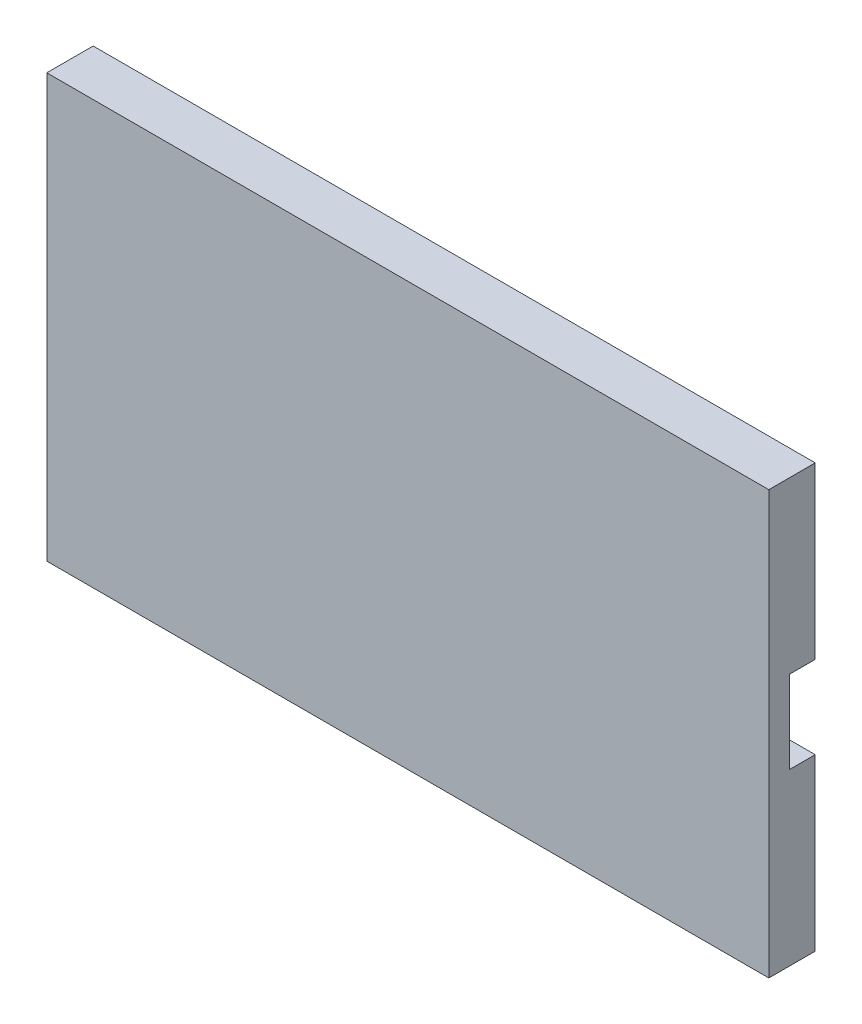
ISO-10303-21;
HEADER;
FILE_DESCRIPTION(('STEP AP214'),'2;1');
FILE_NAME('part.step','',(''),(''),'','','');
FILE_SCHEMA(('AUTOMOTIVE_DESIGN { 1 0 10303 214 1 1 1 1 }'));
ENDSEC;
DATA;
#1=APPLICATION_CONTEXT('core data for automotive mechanical design processes');
#2=APPLICATION_PROTOCOL_DEFINITION('international standard','automotive_design',2000,#1);
#3=PRODUCT_CONTEXT('',#1,'mechanical');
#4=PRODUCT('Part','Part','',(#3));
#5=PRODUCT_RELATED_PRODUCT_CATEGORY('part','',(#4));
#6=PRODUCT_DEFINITION_FORMATION('','',#4);
#7=PRODUCT_DEFINITION_CONTEXT('part definition',#1,'design');
#8=PRODUCT_DEFINITION('design','',#6,#7);
#9=PRODUCT_DEFINITION_SHAPE('','',#8);
#10=(LENGTH_UNIT() NAMED_UNIT(*) SI_UNIT(.MILLI.,.METRE.));
#11=(NAMED_UNIT(*) PLANE_ANGLE_UNIT() SI_UNIT($,.RADIAN.));
#12=(NAMED_UNIT(*) SI_UNIT($,.STERADIAN.) SOLID_ANGLE_UNIT());
#13=UNCERTAINTY_MEASURE_WITH_UNIT(LENGTH_MEASURE(1.E-05),#10,'distance_accuracy_value','');
#14=(GEOMETRIC_REPRESENTATION_CONTEXT(3) GLOBAL_UNCERTAINTY_ASSIGNED_CONTEXT((#13)) GLOBAL_UNIT_ASSIGNED_CONTEXT((#10,
#11,#12)) REPRESENTATION_CONTEXT('',''));
#15=CARTESIAN_POINT('',(0.,0.,0.));
#16=DIRECTION('',(0.,0.,1.));
#17=DIRECTION('',(1.,0.,0.));
#18=AXIS2_PLACEMENT_3D('',#15,#16,#17);
#19=CARTESIAN_POINT('',(4.70000076,0.3999992,0.2499995));
#20=DIRECTION('',(0.,0.,1.));
#21=DIRECTION('',(1.,0.,0.));
#22=AXIS2_PLACEMENT_3D('',#19,#20,#21);
#23=PLANE('',#22);
#24=DIRECTION('',(0.,1.,0.));
#25=VECTOR('',#24,1.);
#26=CARTESIAN_POINT('',(7.00000124,0.3999992,0.2499995));
#27=LINE('',#26,#25);
#28=CARTESIAN_POINT('',(7.00000124,-0.3999992,0.2499995));
#29=VERTEX_POINT('',#28);
#30=CARTESIAN_POINT('',(7.00000124,0.3999992,0.2499995));
#31=VERTEX_POINT('',#30);
#32=EDGE_CURVE('E20',#29,#31,#27,.T.);
#33=ORIENTED_EDGE('',*,*,#32,.F.);
#34=DIRECTION('',(1.,0.,0.));
#35=VECTOR('',#34,1.);
#36=CARTESIAN_POINT('',(7.40000044,-0.3999992,0.2499995));
#37=LINE('',#36,#35);
#38=CARTESIAN_POINT('',(4.70000076,-0.3999992,0.2499995));
#39=VERTEX_POINT('',#38);
#40=EDGE_CURVE('E133',#29,#39,#37,.F.);
#41=ORIENTED_EDGE('',*,*,#40,.T.);
#42=DIRECTION('',(0.,1.,0.));
#43=VECTOR('',#42,1.);
#44=CARTESIAN_POINT('',(4.70000076,-0.3999992,0.2499995));
#45=LINE('',#44,#43);
#46=CARTESIAN_POINT('',(4.70000076,0.3999992,0.2499995));
#47=VERTEX_POINT('',#46);
#48=EDGE_CURVE('E124',#39,#47,#45,.T.);
#49=ORIENTED_EDGE('',*,*,#48,.T.);
#50=DIRECTION('',(1.,0.,0.));
#51=VECTOR('',#50,1.);
#52=CARTESIAN_POINT('',(4.70000076,0.3999992,0.2499995));
#53=LINE('',#52,#51);
#54=EDGE_CURVE('E103',#47,#31,#53,.T.);
#55=ORIENTED_EDGE('',*,*,#54,.T.);
#56=EDGE_LOOP('',(#33,#41,#49,#55));
#57=FACE_BOUND('',#56,.T.);
#58=ADVANCED_FACE('F17',(#57),#23,.F.);
#59=CARTESIAN_POINT('',(-0.3999992,0.3999992,0.2499995));
#60=DIRECTION('',(0.,0.,1.));
#61=DIRECTION('',(1.,0.,0.));
#62=AXIS2_PLACEMENT_3D('',#59,#60,#61);
#63=PLANE('',#62);
#64=DIRECTION('',(0.,1.,0.));
#65=VECTOR('',#64,1.);
#66=CARTESIAN_POINT('',(0.,0.3999992,0.2499995));
#67=LINE('',#66,#65);
#68=CARTESIAN_POINT('',(0.,0.3999992,0.2499995));
#69=VERTEX_POINT('',#68);
#70=CARTESIAN_POINT('',(0.,-0.3999992,0.2499995));
#71=VERTEX_POINT('',#70);
#72=EDGE_CURVE('E117',#69,#71,#67,.F.);
#73=ORIENTED_EDGE('',*,*,#72,.F.);
#74=DIRECTION('',(1.,0.,0.));
#75=VECTOR('',#74,1.);
#76=CARTESIAN_POINT('',(-0.3999992,0.3999992,0.2499995));
#77=LINE('',#76,#75);
#78=CARTESIAN_POINT('',(2.30000048,0.3999992,0.2499995));
#79=VERTEX_POINT('',#78);
#80=EDGE_CURVE('E152',#69,#79,#77,.T.);
#81=ORIENTED_EDGE('',*,*,#80,.T.);
#82=DIRECTION('',(0.,1.,0.));
#83=VECTOR('',#82,1.);
#84=CARTESIAN_POINT('',(2.30000048,0.3999992,0.2499995));
#85=LINE('',#84,#83);
#86=CARTESIAN_POINT('',(2.30000048,-0.3999992,0.2499995));
#87=VERTEX_POINT('',#86);
#88=EDGE_CURVE('E143',#79,#87,#85,.F.);
#89=ORIENTED_EDGE('',*,*,#88,.T.);
#90=DIRECTION('',(1.,0.,0.));
#91=VECTOR('',#90,1.);
#92=CARTESIAN_POINT('',(2.30000048,-0.3999992,0.2499995));
#93=LINE('',#92,#91);
#94=EDGE_CURVE('E135',#87,#71,#93,.F.);
#95=ORIENTED_EDGE('',*,*,#94,.T.);
#96=EDGE_LOOP('',(#73,#81,#89,#95));
#97=FACE_BOUND('',#96,.T.);
#98=ADVANCED_FACE('F251',(#97),#63,.F.);
#99=CARTESIAN_POINT('',(4.70000076,0.3999992,-1.00000054));
#100=DIRECTION('',(0.,1.,0.));
#101=DIRECTION('',(0.,0.,1.));
#102=AXIS2_PLACEMENT_3D('',#99,#100,#101);
#103=PLANE('',#102);
#104=DIRECTION('',(0.,0.,1.));
#105=VECTOR('',#104,1.);
#106=CARTESIAN_POINT('',(7.00000124,0.3999992,-1.00000054));
#107=LINE('',#106,#105);
#108=CARTESIAN_POINT('',(7.00000124,0.3999992,0.));
#109=VERTEX_POINT('',#108);
#110=EDGE_CURVE('E110',#31,#109,#107,.F.);
#111=ORIENTED_EDGE('',*,*,#110,.F.);
#112=ORIENTED_EDGE('',*,*,#54,.F.);
#113=DIRECTION('',(0.,0.,1.));
#114=VECTOR('',#113,1.);
#115=CARTESIAN_POINT('',(4.70000076,0.3999992,-1.00000054));
#116=LINE('',#115,#114);
#117=CARTESIAN_POINT('',(4.70000076,0.3999992,0.));
#118=VERTEX_POINT('',#117);
#119=EDGE_CURVE('E121',#47,#118,#116,.F.);
#120=ORIENTED_EDGE('',*,*,#119,.T.);
#121=DIRECTION('',(-1.,0.,0.));
#122=VECTOR('',#121,1.);
#123=CARTESIAN_POINT('',(0.,0.3999992,0.));
#124=LINE('',#123,#122);
#125=EDGE_CURVE('E119',#109,#118,#124,.T.);
#126=ORIENTED_EDGE('',*,*,#125,.F.);
#127=EDGE_LOOP('',(#111,#112,#120,#126));
#128=FACE_BOUND('',#127,.T.);
#129=ADVANCED_FACE('F118',(#128),#103,.F.);
#130=CARTESIAN_POINT('',(4.70000076,-0.3999992,-1.00000054));
#131=DIRECTION('',(-1.,0.,0.));
#132=DIRECTION('',(0.,0.,1.));
#133=AXIS2_PLACEMENT_3D('',#130,#131,#132);
#134=PLANE('',#133);
#135=DIRECTION('',(0.,0.,-1.));
#136=VECTOR('',#135,1.);
#137=CARTESIAN_POINT('',(4.70000076,-0.3999992,-1.00000054));
#138=LINE('',#137,#136);
#139=CARTESIAN_POINT('',(4.70000076,-0.3999992,0.));
#140=VERTEX_POINT('',#139);
#141=EDGE_CURVE('E129',#39,#140,#138,.T.);
#142=ORIENTED_EDGE('',*,*,#141,.T.);
#143=DIRECTION('',(0.,1.,0.));
#144=VECTOR('',#143,1.);
#145=CARTESIAN_POINT('',(4.70000076,2.04999844,0.));
#146=LINE('',#145,#144);
#147=EDGE_CURVE('E156',#118,#140,#146,.F.);
#148=ORIENTED_EDGE('',*,*,#147,.F.);
#149=ORIENTED_EDGE('',*,*,#119,.F.);
#150=ORIENTED_EDGE('',*,*,#48,.F.);
#151=EDGE_LOOP('',(#142,#148,#149,#150));
#152=FACE_BOUND('',#151,.T.);
#153=ADVANCED_FACE('F245',(#152),#134,.F.);
#154=CARTESIAN_POINT('',(7.40000044,-0.3999992,-1.00000054));
#155=DIRECTION('',(0.,-1.,0.));
#156=DIRECTION('',(0.,0.,-1.));
#157=AXIS2_PLACEMENT_3D('',#154,#155,#156);
#158=PLANE('',#157);
#159=DIRECTION('',(0.,0.,-1.));
#160=VECTOR('',#159,1.);
#161=CARTESIAN_POINT('',(7.00000124,-0.3999992,-1.00000054));
#162=LINE('',#161,#160);
#163=CARTESIAN_POINT('',(7.00000124,-0.3999992,0.));
#164=VERTEX_POINT('',#163);
#165=EDGE_CURVE('E113',#164,#29,#162,.F.);
#166=ORIENTED_EDGE('',*,*,#165,.F.);
#167=DIRECTION('',(-1.,0.,0.));
#168=VECTOR('',#167,1.);
#169=CARTESIAN_POINT('',(0.,-0.3999992,0.));
#170=LINE('',#169,#168);
#171=EDGE_CURVE('E158',#140,#164,#170,.F.);
#172=ORIENTED_EDGE('',*,*,#171,.F.);
#173=ORIENTED_EDGE('',*,*,#141,.F.);
#174=ORIENTED_EDGE('',*,*,#40,.F.);
#175=EDGE_LOOP('',(#166,#172,#173,#174));
#176=FACE_BOUND('',#175,.T.);
#177=ADVANCED_FACE('F241',(#176),#158,.F.);
#178=CARTESIAN_POINT('',(2.30000048,-0.3999992,-1.00000054));
#179=DIRECTION('',(0.,-1.,0.));
#180=DIRECTION('',(0.,0.,-1.));
#181=AXIS2_PLACEMENT_3D('',#178,#179,#180);
#182=PLANE('',#181);
#183=DIRECTION('',(0.,0.,-1.));
#184=VECTOR('',#183,1.);
#185=CARTESIAN_POINT('',(0.,-0.3999992,-1.00000054));
#186=LINE('',#185,#184);
#187=CARTESIAN_POINT('',(0.,-0.3999992,0.));
#188=VERTEX_POINT('',#187);
#189=EDGE_CURVE('E138',#71,#188,#186,.T.);
#190=ORIENTED_EDGE('',*,*,#189,.F.);
#191=ORIENTED_EDGE('',*,*,#94,.F.);
#192=DIRECTION('',(0.,0.,-1.));
#193=VECTOR('',#192,1.);
#194=CARTESIAN_POINT('',(2.30000048,-0.3999992,-1.00000054));
#195=LINE('',#194,#193);
#196=CARTESIAN_POINT('',(2.30000048,-0.3999992,0.));
#197=VERTEX_POINT('',#196);
#198=EDGE_CURVE('E140',#87,#197,#195,.T.);
#199=ORIENTED_EDGE('',*,*,#198,.T.);
#200=DIRECTION('',(-1.,0.,0.));
#201=VECTOR('',#200,1.);
#202=CARTESIAN_POINT('',(0.,-0.3999992,0.));
#203=LINE('',#202,#201);
#204=EDGE_CURVE('E161',#188,#197,#203,.F.);
#205=ORIENTED_EDGE('',*,*,#204,.F.);
#206=EDGE_LOOP('',(#190,#191,#199,#205));
#207=FACE_BOUND('',#206,.T.);
#208=ADVANCED_FACE('F237',(#207),#182,.F.);
#209=CARTESIAN_POINT('',(2.30000048,0.3999992,-1.00000054));
#210=DIRECTION('',(1.,0.,0.));
#211=DIRECTION('',(0.,0.,-1.));
#212=AXIS2_PLACEMENT_3D('',#209,#210,#211);
#213=PLANE('',#212);
#214=DIRECTION('',(0.,0.,1.));
#215=VECTOR('',#214,1.);
#216=CARTESIAN_POINT('',(2.30000048,0.3999992,-1.00000054));
#217=LINE('',#216,#215);
#218=CARTESIAN_POINT('',(2.30000048,0.3999992,0.));
#219=VERTEX_POINT('',#218);
#220=EDGE_CURVE('E146',#79,#219,#217,.F.);
#221=ORIENTED_EDGE('',*,*,#220,.T.);
#222=DIRECTION('',(0.,1.,0.));
#223=VECTOR('',#222,1.);
#224=CARTESIAN_POINT('',(2.30000048,2.04999844,0.));
#225=LINE('',#224,#223);
#226=EDGE_CURVE('E163',#197,#219,#225,.T.);
#227=ORIENTED_EDGE('',*,*,#226,.F.);
#228=ORIENTED_EDGE('',*,*,#198,.F.);
#229=ORIENTED_EDGE('',*,*,#88,.F.);
#230=EDGE_LOOP('',(#221,#227,#228,#229));
#231=FACE_BOUND('',#230,.T.);
#232=ADVANCED_FACE('F233',(#231),#213,.F.);
#233=CARTESIAN_POINT('',(-0.3999992,0.3999992,-1.00000054));
#234=DIRECTION('',(0.,1.,0.));
#235=DIRECTION('',(0.,0.,1.));
#236=AXIS2_PLACEMENT_3D('',#233,#234,#235);
#237=PLANE('',#236);
#238=DIRECTION('',(0.,0.,1.));
#239=VECTOR('',#238,1.);
#240=CARTESIAN_POINT('',(0.,0.3999992,-1.00000054));
#241=LINE('',#240,#239);
#242=CARTESIAN_POINT('',(0.,0.3999992,0.));
#243=VERTEX_POINT('',#242);
#244=EDGE_CURVE('E149',#243,#69,#241,.T.);
#245=ORIENTED_EDGE('',*,*,#244,.F.);
#246=DIRECTION('',(-1.,0.,0.));
#247=VECTOR('',#246,1.);
#248=CARTESIAN_POINT('',(0.,0.3999992,0.));
#249=LINE('',#248,#247);
#250=EDGE_CURVE('E165',#219,#243,#249,.T.);
#251=ORIENTED_EDGE('',*,*,#250,.F.);
#252=ORIENTED_EDGE('',*,*,#220,.F.);
#253=ORIENTED_EDGE('',*,*,#80,.F.);
#254=EDGE_LOOP('',(#245,#251,#252,#253));
#255=FACE_BOUND('',#254,.T.);
#256=ADVANCED_FACE('F229',(#255),#237,.F.);
#257=CARTESIAN_POINT('',(0.,2.04999844,0.));
#258=DIRECTION('',(0.,0.,-1.));
#259=DIRECTION('',(-1.,0.,0.));
#260=AXIS2_PLACEMENT_3D('',#257,#258,#259);
#261=PLANE('',#260);
#262=ORIENTED_EDGE('',*,*,#250,.T.);
#263=DIRECTION('',(0.,1.,0.));
#264=VECTOR('',#263,1.);
#265=CARTESIAN_POINT('',(0.,2.04999844,0.));
#266=LINE('',#265,#264);
#267=CARTESIAN_POINT('',(0.,2.04999844,0.));
#268=VERTEX_POINT('',#267);
#269=EDGE_CURVE('E168',#243,#268,#266,.T.);
#270=ORIENTED_EDGE('',*,*,#269,.T.);
#271=DIRECTION('',(1.,0.,0.));
#272=VECTOR('',#271,1.);
#273=CARTESIAN_POINT('',(7.00000124,2.04999844,0.));
#274=LINE('',#273,#272);
#275=CARTESIAN_POINT('',(7.00000124,2.04999844,0.));
#276=VERTEX_POINT('',#275);
#277=EDGE_CURVE('E174',#268,#276,#274,.T.);
#278=ORIENTED_EDGE('',*,*,#277,.T.);
#279=DIRECTION('',(0.,1.,0.));
#280=VECTOR('',#279,1.);
#281=CARTESIAN_POINT('',(7.00000124,-2.05000098,0.));
#282=LINE('',#281,#280);
#283=EDGE_CURVE('E180',#276,#109,#282,.F.);
#284=ORIENTED_EDGE('',*,*,#283,.T.);
#285=ORIENTED_EDGE('',*,*,#125,.T.);
#286=ORIENTED_EDGE('',*,*,#147,.T.);
#287=ORIENTED_EDGE('',*,*,#171,.T.);
#288=DIRECTION('',(0.,1.,0.));
#289=VECTOR('',#288,1.);
#290=CARTESIAN_POINT('',(7.00000124,-2.05000098,0.));
#291=LINE('',#290,#289);
#292=CARTESIAN_POINT('',(7.00000124,-2.05000098,0.));
#293=VERTEX_POINT('',#292);
#294=EDGE_CURVE('E182',#164,#293,#291,.F.);
#295=ORIENTED_EDGE('',*,*,#294,.T.);
#296=DIRECTION('',(1.,0.,0.));
#297=VECTOR('',#296,1.);
#298=CARTESIAN_POINT('',(0.,-2.05000098,0.));
#299=LINE('',#298,#297);
#300=CARTESIAN_POINT('',(0.,-2.05000098,0.));
#301=VERTEX_POINT('',#300);
#302=EDGE_CURVE('E188',#293,#301,#299,.F.);
#303=ORIENTED_EDGE('',*,*,#302,.T.);
#304=DIRECTION('',(0.,1.,0.));
#305=VECTOR('',#304,1.);
#306=CARTESIAN_POINT('',(0.,2.04999844,0.));
#307=LINE('',#306,#305);
#308=EDGE_CURVE('E171',#301,#188,#307,.T.);
#309=ORIENTED_EDGE('',*,*,#308,.T.);
#310=ORIENTED_EDGE('',*,*,#204,.T.);
#311=ORIENTED_EDGE('',*,*,#226,.T.);
#312=EDGE_LOOP('',(#262,#270,#278,#284,#285,#286,#287,#295,#303,#309,#310,#311));
#313=FACE_BOUND('',#312,.T.);
#314=ADVANCED_FACE('F226',(#313),#261,.T.);
#315=CARTESIAN_POINT('',(0.,2.04999844,0.));
#316=DIRECTION('',(1.,0.,0.));
#317=DIRECTION('',(0.,0.,-1.));
#318=AXIS2_PLACEMENT_3D('',#315,#316,#317);
#319=PLANE('',#318);
#320=ORIENTED_EDGE('',*,*,#308,.F.);
#321=DIRECTION('',(0.,0.,1.));
#322=VECTOR('',#321,1.);
#323=CARTESIAN_POINT('',(0.,-2.05000098,0.));
#324=LINE('',#323,#322);
#325=CARTESIAN_POINT('',(0.,-2.05000098,0.4499991));
#326=VERTEX_POINT('',#325);
#327=EDGE_CURVE('E191',#301,#326,#324,.T.);
#328=ORIENTED_EDGE('',*,*,#327,.T.);
#329=DIRECTION('',(0.,1.,0.));
#330=VECTOR('',#329,1.);
#331=CARTESIAN_POINT('',(0.,2.04999844,0.4499991));
#332=LINE('',#331,#330);
#333=CARTESIAN_POINT('',(0.,2.04999844,0.4499991));
#334=VERTEX_POINT('',#333);
#335=EDGE_CURVE('E195',#326,#334,#332,.T.);
#336=ORIENTED_EDGE('',*,*,#335,.T.);
#337=DIRECTION('',(0.,0.,-1.));
#338=VECTOR('',#337,1.);
#339=CARTESIAN_POINT('',(0.,2.04999844,0.));
#340=LINE('',#339,#338);
#341=EDGE_CURVE('E177',#334,#268,#340,.T.);
#342=ORIENTED_EDGE('',*,*,#341,.T.);
#343=ORIENTED_EDGE('',*,*,#269,.F.);
#344=ORIENTED_EDGE('',*,*,#244,.T.);
#345=ORIENTED_EDGE('',*,*,#72,.T.);
#346=ORIENTED_EDGE('',*,*,#189,.T.);
#347=EDGE_LOOP('',(#320,#328,#336,#342,#343,#344,#345,#346));
#348=FACE_BOUND('',#347,.T.);
#349=ADVANCED_FACE('F209',(#348),#319,.F.);
#350=CARTESIAN_POINT('',(7.00000124,2.04999844,0.));
#351=DIRECTION('',(0.,-1.,0.));
#352=DIRECTION('',(0.,0.,-1.));
#353=AXIS2_PLACEMENT_3D('',#350,#351,#352);
#354=PLANE('',#353);
#355=DIRECTION('',(-1.,0.,0.));
#356=VECTOR('',#355,1.);
#357=CARTESIAN_POINT('',(0.,2.04999844,0.4499991));
#358=LINE('',#357,#356);
#359=CARTESIAN_POINT('',(7.00000124,2.04999844,0.4499991));
#360=VERTEX_POINT('',#359);
#361=EDGE_CURVE('E198',#334,#360,#358,.F.);
#362=ORIENTED_EDGE('',*,*,#361,.T.);
#363=DIRECTION('',(0.,0.,1.));
#364=VECTOR('',#363,1.);
#365=CARTESIAN_POINT('',(7.00000124,2.04999844,0.));
#366=LINE('',#365,#364);
#367=EDGE_CURVE('E185',#360,#276,#366,.F.);
#368=ORIENTED_EDGE('',*,*,#367,.T.);
#369=ORIENTED_EDGE('',*,*,#277,.F.);
#370=ORIENTED_EDGE('',*,*,#341,.F.);
#371=EDGE_LOOP('',(#362,#368,#369,#370));
#372=FACE_BOUND('',#371,.T.);
#373=ADVANCED_FACE('F206',(#372),#354,.F.);
#374=CARTESIAN_POINT('',(7.00000124,-2.05000098,0.));
#375=DIRECTION('',(-1.,0.,0.));
#376=DIRECTION('',(0.,0.,1.));
#377=AXIS2_PLACEMENT_3D('',#374,#375,#376);
#378=PLANE('',#377);
#379=DIRECTION('',(0.,1.,0.));
#380=VECTOR('',#379,1.);
#381=CARTESIAN_POINT('',(7.00000124,2.04999844,0.4499991));
#382=LINE('',#381,#380);
#383=CARTESIAN_POINT('',(7.00000124,-2.05000098,0.4499991));
#384=VERTEX_POINT('',#383);
#385=EDGE_CURVE('E26',#360,#384,#382,.F.);
#386=ORIENTED_EDGE('',*,*,#385,.T.);
#387=DIRECTION('',(0.,0.,1.));
#388=VECTOR('',#387,1.);
#389=CARTESIAN_POINT('',(7.00000124,-2.05000098,0.));
#390=LINE('',#389,#388);
#391=EDGE_CURVE('E34',#384,#293,#390,.F.);
#392=ORIENTED_EDGE('',*,*,#391,.T.);
#393=ORIENTED_EDGE('',*,*,#294,.F.);
#394=ORIENTED_EDGE('',*,*,#165,.T.);
#395=ORIENTED_EDGE('',*,*,#32,.T.);
#396=ORIENTED_EDGE('',*,*,#110,.T.);
#397=ORIENTED_EDGE('',*,*,#283,.F.);
#398=ORIENTED_EDGE('',*,*,#367,.F.);
#399=EDGE_LOOP('',(#386,#392,#393,#394,#395,#396,#397,#398));
#400=FACE_BOUND('',#399,.T.);
#401=ADVANCED_FACE('F109',(#400),#378,.F.);
#402=CARTESIAN_POINT('',(0.,-2.05000098,0.));
#403=DIRECTION('',(0.,1.,0.));
#404=DIRECTION('',(0.,0.,1.));
#405=AXIS2_PLACEMENT_3D('',#402,#403,#404);
#406=PLANE('',#405);
#407=DIRECTION('',(-1.,0.,0.));
#408=VECTOR('',#407,1.);
#409=CARTESIAN_POINT('',(0.,-2.05000098,0.4499991));
#410=LINE('',#409,#408);
#411=EDGE_CURVE('E11',#384,#326,#410,.T.);
#412=ORIENTED_EDGE('',*,*,#411,.T.);
#413=ORIENTED_EDGE('',*,*,#327,.F.);
#414=ORIENTED_EDGE('',*,*,#302,.F.);
#415=ORIENTED_EDGE('',*,*,#391,.F.);
#416=EDGE_LOOP('',(#412,#413,#414,#415));
#417=FACE_BOUND('',#416,.T.);
#418=ADVANCED_FACE('F211',(#417),#406,.F.);
#419=CARTESIAN_POINT('',(0.,2.04999844,0.4499991));
#420=DIRECTION('',(0.,0.,-1.));
#421=DIRECTION('',(-1.,0.,0.));
#422=AXIS2_PLACEMENT_3D('',#419,#420,#421);
#423=PLANE('',#422);
#424=ORIENTED_EDGE('',*,*,#385,.F.);
#425=ORIENTED_EDGE('',*,*,#361,.F.);
#426=ORIENTED_EDGE('',*,*,#335,.F.);
#427=ORIENTED_EDGE('',*,*,#411,.F.);
#428=EDGE_LOOP('',(#424,#425,#426,#427));
#429=FACE_BOUND('',#428,.T.);
#430=ADVANCED_FACE('F204',(#429),#423,.F.);
#431=CLOSED_SHELL('',(#58,#98,#129,#153,#177,#208,#232,#256,#314,#349,#373,#401,#418,#430));
#432=MANIFOLD_SOLID_BREP('B1',#431);
#433=ADVANCED_BREP_SHAPE_REPRESENTATION('',(#18,#432),#14);
#434=SHAPE_DEFINITION_REPRESENTATION(#9,#433);
ENDSEC;
END-ISO-10303-21;
